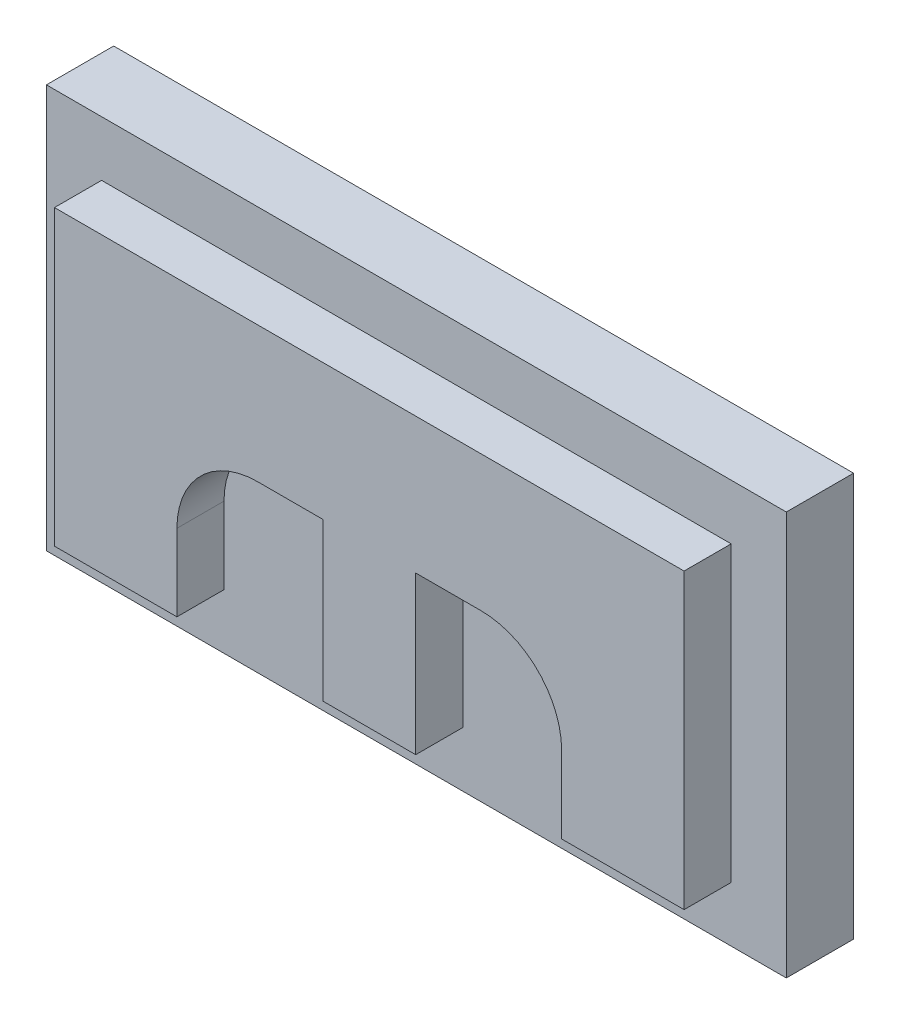
ISO-10303-21;
HEADER;
FILE_DESCRIPTION(('STEP AP214'),'2;1');
FILE_NAME('part.step','',(''),(''),'','','');
FILE_SCHEMA(('AUTOMOTIVE_DESIGN { 1 0 10303 214 1 1 1 1 }'));
ENDSEC;
DATA;
#1=APPLICATION_CONTEXT('core data for automotive mechanical design processes');
#2=APPLICATION_PROTOCOL_DEFINITION('international standard','automotive_design',2000,#1);
#3=PRODUCT_CONTEXT('',#1,'mechanical');
#4=PRODUCT('Part','Part','',(#3));
#5=PRODUCT_RELATED_PRODUCT_CATEGORY('part','',(#4));
#6=PRODUCT_DEFINITION_FORMATION('','',#4);
#7=PRODUCT_DEFINITION_CONTEXT('part definition',#1,'design');
#8=PRODUCT_DEFINITION('design','',#6,#7);
#9=PRODUCT_DEFINITION_SHAPE('','',#8);
#10=(LENGTH_UNIT() NAMED_UNIT(*) SI_UNIT(.MILLI.,.METRE.));
#11=(NAMED_UNIT(*) PLANE_ANGLE_UNIT() SI_UNIT($,.RADIAN.));
#12=(NAMED_UNIT(*) SI_UNIT($,.STERADIAN.) SOLID_ANGLE_UNIT());
#13=UNCERTAINTY_MEASURE_WITH_UNIT(LENGTH_MEASURE(1.E-05),#10,'distance_accuracy_value','');
#14=(GEOMETRIC_REPRESENTATION_CONTEXT(3) GLOBAL_UNCERTAINTY_ASSIGNED_CONTEXT((#13)) GLOBAL_UNIT_ASSIGNED_CONTEXT((#10,
#11,#12)) REPRESENTATION_CONTEXT('',''));
#15=CARTESIAN_POINT('',(0.,0.,0.));
#16=DIRECTION('',(0.,0.,1.));
#17=DIRECTION('',(1.,0.,0.));
#18=AXIS2_PLACEMENT_3D('',#15,#16,#17);
#19=CARTESIAN_POINT('',(8.2,8.2,17.));
#20=DIRECTION('',(0.,1.,0.));
#21=DIRECTION('',(0.,0.,1.));
#22=AXIS2_PLACEMENT_3D('',#19,#20,#21);
#23=PLANE('',#22);
#24=DIRECTION('',(0.,0.,1.));
#25=VECTOR('',#24,1.);
#26=CARTESIAN_POINT('',(83.6,8.2,10.));
#27=LINE('',#26,#25);
#28=CARTESIAN_POINT('',(83.6,8.2,10.));
#29=VERTEX_POINT('',#28);
#30=CARTESIAN_POINT('',(83.6,8.2,17.));
#31=VERTEX_POINT('',#30);
#32=EDGE_CURVE('E193',#29,#31,#27,.T.);
#33=ORIENTED_EDGE('',*,*,#32,.F.);
#34=DIRECTION('',(1.,0.,0.));
#35=VECTOR('',#34,1.);
#36=CARTESIAN_POINT('',(8.2,8.2,10.));
#37=LINE('',#36,#35);
#38=CARTESIAN_POINT('',(101.8,8.2,10.));
#39=VERTEX_POINT('',#38);
#40=EDGE_CURVE('E237',#29,#39,#37,.T.);
#41=ORIENTED_EDGE('',*,*,#40,.T.);
#42=DIRECTION('',(0.,0.,-1.));
#43=VECTOR('',#42,1.);
#44=CARTESIAN_POINT('',(101.8,8.2,17.));
#45=LINE('',#44,#43);
#46=CARTESIAN_POINT('',(101.8,8.2,17.));
#47=VERTEX_POINT('',#46);
#48=EDGE_CURVE('E252',#47,#39,#45,.T.);
#49=ORIENTED_EDGE('',*,*,#48,.F.);
#50=DIRECTION('',(1.,0.,0.));
#51=VECTOR('',#50,1.);
#52=CARTESIAN_POINT('',(8.2,8.2,17.));
#53=LINE('',#52,#51);
#54=EDGE_CURVE('E224',#31,#47,#53,.T.);
#55=ORIENTED_EDGE('',*,*,#54,.F.);
#56=EDGE_LOOP('',(#33,#41,#49,#55));
#57=FACE_BOUND('',#56,.T.);
#58=ADVANCED_FACE('F39',(#57),#23,.F.);
#59=DIRECTION('',(0.,0.,1.));
#60=VECTOR('',#59,1.);
#61=CARTESIAN_POINT('',(61.9,8.2,10.));
#62=LINE('',#61,#60);
#63=CARTESIAN_POINT('',(61.9,8.2,10.));
#64=VERTEX_POINT('',#63);
#65=CARTESIAN_POINT('',(61.9,8.2,17.));
#66=VERTEX_POINT('',#65);
#67=EDGE_CURVE('E167',#64,#66,#62,.T.);
#68=ORIENTED_EDGE('',*,*,#67,.T.);
#69=CARTESIAN_POINT('',(48.1,8.2,17.));
#70=VERTEX_POINT('',#69);
#71=EDGE_CURVE('E230',#70,#66,#53,.T.);
#72=ORIENTED_EDGE('',*,*,#71,.F.);
#73=DIRECTION('',(0.,0.,1.));
#74=VECTOR('',#73,1.);
#75=CARTESIAN_POINT('',(48.1,8.2,10.));
#76=LINE('',#75,#74);
#77=CARTESIAN_POINT('',(48.1,8.2,10.));
#78=VERTEX_POINT('',#77);
#79=EDGE_CURVE('E217',#78,#70,#76,.T.);
#80=ORIENTED_EDGE('',*,*,#79,.F.);
#81=EDGE_CURVE('E242',#78,#64,#37,.T.);
#82=ORIENTED_EDGE('',*,*,#81,.T.);
#83=EDGE_LOOP('',(#68,#72,#80,#82));
#84=FACE_BOUND('',#83,.T.);
#85=ADVANCED_FACE('F305',(#84),#23,.F.);
#86=CARTESIAN_POINT('',(0.,0.,17.));
#87=DIRECTION('',(0.,0.,1.));
#88=DIRECTION('',(1.,0.,0.));
#89=AXIS2_PLACEMENT_3D('',#86,#87,#88);
#90=PLANE('',#89);
#91=DIRECTION('',(1.,0.,0.));
#92=VECTOR('',#91,1.);
#93=CARTESIAN_POINT('',(83.6,31.6,17.));
#94=LINE('',#93,#92);
#95=CARTESIAN_POINT('',(61.9,31.6,17.));
#96=VERTEX_POINT('',#95);
#97=CARTESIAN_POINT('',(71.6,31.6,17.));
#98=VERTEX_POINT('',#97);
#99=EDGE_CURVE('E179',#96,#98,#94,.T.);
#100=ORIENTED_EDGE('',*,*,#99,.T.);
#101=CARTESIAN_POINT('',(71.6,19.6,17.));
#102=DIRECTION('',(0.,0.,1.));
#103=DIRECTION('',(1.,0.,0.));
#104=AXIS2_PLACEMENT_3D('',#101,#102,#103);
#105=CIRCLE('',#104,12.);
#106=CARTESIAN_POINT('',(83.6,19.6,17.));
#107=VERTEX_POINT('',#106);
#108=EDGE_CURVE('E11',#98,#107,#105,.F.);
#109=ORIENTED_EDGE('',*,*,#108,.T.);
#110=DIRECTION('',(0.,-1.,0.));
#111=VECTOR('',#110,1.);
#112=CARTESIAN_POINT('',(83.6,31.6,17.));
#113=LINE('',#112,#111);
#114=EDGE_CURVE('E189',#107,#31,#113,.T.);
#115=ORIENTED_EDGE('',*,*,#114,.T.);
#116=ORIENTED_EDGE('',*,*,#54,.T.);
#117=DIRECTION('',(0.,1.,0.));
#118=VECTOR('',#117,1.);
#119=CARTESIAN_POINT('',(101.8,51.8,17.));
#120=LINE('',#119,#118);
#121=CARTESIAN_POINT('',(101.8,51.8,17.));
#122=VERTEX_POINT('',#121);
#123=EDGE_CURVE('E229',#47,#122,#120,.T.);
#124=ORIENTED_EDGE('',*,*,#123,.T.);
#125=DIRECTION('',(-1.,0.,0.));
#126=VECTOR('',#125,1.);
#127=CARTESIAN_POINT('',(8.2,51.8,17.));
#128=LINE('',#127,#126);
#129=CARTESIAN_POINT('',(8.2,51.8,17.));
#130=VERTEX_POINT('',#129);
#131=EDGE_CURVE('E232',#122,#130,#128,.T.);
#132=ORIENTED_EDGE('',*,*,#131,.T.);
#133=DIRECTION('',(0.,-1.,0.));
#134=VECTOR('',#133,1.);
#135=CARTESIAN_POINT('',(8.2,51.8,17.));
#136=LINE('',#135,#134);
#137=CARTESIAN_POINT('',(8.2,8.2,17.));
#138=VERTEX_POINT('',#137);
#139=EDGE_CURVE('E221',#130,#138,#136,.T.);
#140=ORIENTED_EDGE('',*,*,#139,.T.);
#141=CARTESIAN_POINT('',(26.4,8.2,17.));
#142=VERTEX_POINT('',#141);
#143=EDGE_CURVE('E226',#138,#142,#53,.T.);
#144=ORIENTED_EDGE('',*,*,#143,.T.);
#145=DIRECTION('',(0.,-1.,0.));
#146=VECTOR('',#145,1.);
#147=CARTESIAN_POINT('',(26.4,31.6,17.));
#148=LINE('',#147,#146);
#149=CARTESIAN_POINT('',(26.4,19.6,17.));
#150=VERTEX_POINT('',#149);
#151=EDGE_CURVE('E196',#150,#142,#148,.T.);
#152=ORIENTED_EDGE('',*,*,#151,.F.);
#153=CARTESIAN_POINT('',(38.4,19.6,17.));
#154=DIRECTION('',(0.,0.,1.));
#155=DIRECTION('',(1.,0.,0.));
#156=AXIS2_PLACEMENT_3D('',#153,#154,#155);
#157=CIRCLE('',#156,12.);
#158=CARTESIAN_POINT('',(38.4,31.6,17.));
#159=VERTEX_POINT('',#158);
#160=EDGE_CURVE('E295',#150,#159,#157,.F.);
#161=ORIENTED_EDGE('',*,*,#160,.T.);
#162=DIRECTION('',(-1.,0.,0.));
#163=VECTOR('',#162,1.);
#164=CARTESIAN_POINT('',(26.4,31.6,17.));
#165=LINE('',#164,#163);
#166=CARTESIAN_POINT('',(48.1,31.6,17.));
#167=VERTEX_POINT('',#166);
#168=EDGE_CURVE('E201',#167,#159,#165,.T.);
#169=ORIENTED_EDGE('',*,*,#168,.F.);
#170=DIRECTION('',(0.,1.,0.));
#171=VECTOR('',#170,1.);
#172=CARTESIAN_POINT('',(48.1,31.6,17.));
#173=LINE('',#172,#171);
#174=EDGE_CURVE('E209',#70,#167,#173,.T.);
#175=ORIENTED_EDGE('',*,*,#174,.F.);
#176=ORIENTED_EDGE('',*,*,#71,.T.);
#177=DIRECTION('',(0.,1.,0.));
#178=VECTOR('',#177,1.);
#179=CARTESIAN_POINT('',(61.9,31.6,17.));
#180=LINE('',#179,#178);
#181=EDGE_CURVE('E186',#66,#96,#180,.T.);
#182=ORIENTED_EDGE('',*,*,#181,.T.);
#183=EDGE_LOOP('',(#100,#109,#115,#116,#124,#132,#140,#144,#152,#161,#169,#175,#176,#182));
#184=FACE_BOUND('',#183,.T.);
#185=ADVANCED_FACE('F300',(#184),#90,.T.);
#186=CARTESIAN_POINT('',(8.2,8.2,10.));
#187=VERTEX_POINT('',#186);
#188=CARTESIAN_POINT('',(26.4,8.2,10.));
#189=VERTEX_POINT('',#188);
#190=EDGE_CURVE('E238',#187,#189,#37,.T.);
#191=ORIENTED_EDGE('',*,*,#190,.T.);
#192=DIRECTION('',(0.,0.,1.));
#193=VECTOR('',#192,1.);
#194=CARTESIAN_POINT('',(26.4,8.2,10.));
#195=LINE('',#194,#193);
#196=EDGE_CURVE('E207',#189,#142,#195,.T.);
#197=ORIENTED_EDGE('',*,*,#196,.T.);
#198=ORIENTED_EDGE('',*,*,#143,.F.);
#199=DIRECTION('',(0.,0.,-1.));
#200=VECTOR('',#199,1.);
#201=CARTESIAN_POINT('',(8.2,8.2,17.));
#202=LINE('',#201,#200);
#203=EDGE_CURVE('E255',#138,#187,#202,.T.);
#204=ORIENTED_EDGE('',*,*,#203,.T.);
#205=EDGE_LOOP('',(#191,#197,#198,#204));
#206=FACE_BOUND('',#205,.T.);
#207=ADVANCED_FACE('F327',(#206),#23,.F.);
#208=CARTESIAN_POINT('',(0.,0.,10.));
#209=DIRECTION('',(0.,0.,-1.));
#210=DIRECTION('',(-1.,0.,0.));
#211=AXIS2_PLACEMENT_3D('',#208,#209,#210);
#212=PLANE('',#211);
#213=DIRECTION('',(0.,-1.,0.));
#214=VECTOR('',#213,1.);
#215=CARTESIAN_POINT('',(0.,0.,10.));
#216=LINE('',#215,#214);
#217=CARTESIAN_POINT('',(0.,60.,10.));
#218=VERTEX_POINT('',#217);
#219=CARTESIAN_POINT('',(0.,0.,10.));
#220=VERTEX_POINT('',#219);
#221=EDGE_CURVE('E259',#218,#220,#216,.T.);
#222=ORIENTED_EDGE('',*,*,#221,.T.);
#223=DIRECTION('',(1.,0.,0.));
#224=VECTOR('',#223,1.);
#225=CARTESIAN_POINT('',(0.,0.,10.));
#226=LINE('',#225,#224);
#227=CARTESIAN_POINT('',(110.,0.,10.));
#228=VERTEX_POINT('',#227);
#229=EDGE_CURVE('E262',#220,#228,#226,.T.);
#230=ORIENTED_EDGE('',*,*,#229,.T.);
#231=DIRECTION('',(0.,1.,0.));
#232=VECTOR('',#231,1.);
#233=CARTESIAN_POINT('',(110.,0.,10.));
#234=LINE('',#233,#232);
#235=CARTESIAN_POINT('',(110.,60.,10.));
#236=VERTEX_POINT('',#235);
#237=EDGE_CURVE('E265',#228,#236,#234,.T.);
#238=ORIENTED_EDGE('',*,*,#237,.T.);
#239=DIRECTION('',(-1.,0.,0.));
#240=VECTOR('',#239,1.);
#241=CARTESIAN_POINT('',(0.,60.,10.));
#242=LINE('',#241,#240);
#243=EDGE_CURVE('E267',#236,#218,#242,.T.);
#244=ORIENTED_EDGE('',*,*,#243,.T.);
#245=EDGE_LOOP('',(#222,#230,#238,#244));
#246=FACE_BOUND('',#245,.T.);
#247=DIRECTION('',(0.,-1.,0.));
#248=VECTOR('',#247,1.);
#249=CARTESIAN_POINT('',(83.6,31.6,10.));
#250=LINE('',#249,#248);
#251=CARTESIAN_POINT('',(83.6,19.6,10.));
#252=VERTEX_POINT('',#251);
#253=EDGE_CURVE('E184',#252,#29,#250,.T.);
#254=ORIENTED_EDGE('',*,*,#253,.F.);
#255=CARTESIAN_POINT('',(71.6,19.6,10.));
#256=DIRECTION('',(0.,0.,-1.));
#257=DIRECTION('',(-1.,0.,0.));
#258=AXIS2_PLACEMENT_3D('',#255,#256,#257);
#259=CIRCLE('',#258,12.);
#260=CARTESIAN_POINT('',(71.6,31.6,10.));
#261=VERTEX_POINT('',#260);
#262=EDGE_CURVE('E47',#252,#261,#259,.F.);
#263=ORIENTED_EDGE('',*,*,#262,.T.);
#264=DIRECTION('',(1.,0.,0.));
#265=VECTOR('',#264,1.);
#266=CARTESIAN_POINT('',(83.6,31.6,10.));
#267=LINE('',#266,#265);
#268=CARTESIAN_POINT('',(61.9,31.6,10.));
#269=VERTEX_POINT('',#268);
#270=EDGE_CURVE('E172',#269,#261,#267,.T.);
#271=ORIENTED_EDGE('',*,*,#270,.F.);
#272=DIRECTION('',(0.,1.,0.));
#273=VECTOR('',#272,1.);
#274=CARTESIAN_POINT('',(61.9,31.6,10.));
#275=LINE('',#274,#273);
#276=EDGE_CURVE('E161',#64,#269,#275,.T.);
#277=ORIENTED_EDGE('',*,*,#276,.F.);
#278=ORIENTED_EDGE('',*,*,#81,.F.);
#279=DIRECTION('',(0.,1.,0.));
#280=VECTOR('',#279,1.);
#281=CARTESIAN_POINT('',(48.1,31.6,10.));
#282=LINE('',#281,#280);
#283=CARTESIAN_POINT('',(48.1,31.6,10.));
#284=VERTEX_POINT('',#283);
#285=EDGE_CURVE('E200',#78,#284,#282,.T.);
#286=ORIENTED_EDGE('',*,*,#285,.T.);
#287=DIRECTION('',(-1.,0.,0.));
#288=VECTOR('',#287,1.);
#289=CARTESIAN_POINT('',(26.4,31.6,10.));
#290=LINE('',#289,#288);
#291=CARTESIAN_POINT('',(38.4,31.6,10.));
#292=VERTEX_POINT('',#291);
#293=EDGE_CURVE('E204',#284,#292,#290,.T.);
#294=ORIENTED_EDGE('',*,*,#293,.T.);
#295=CARTESIAN_POINT('',(38.4,19.6,10.));
#296=DIRECTION('',(0.,0.,-1.));
#297=DIRECTION('',(-1.,0.,0.));
#298=AXIS2_PLACEMENT_3D('',#295,#296,#297);
#299=CIRCLE('',#298,12.);
#300=CARTESIAN_POINT('',(26.4,19.6,10.));
#301=VERTEX_POINT('',#300);
#302=EDGE_CURVE('E293',#292,#301,#299,.F.);
#303=ORIENTED_EDGE('',*,*,#302,.T.);
#304=DIRECTION('',(0.,-1.,0.));
#305=VECTOR('',#304,1.);
#306=CARTESIAN_POINT('',(26.4,31.6,10.));
#307=LINE('',#306,#305);
#308=EDGE_CURVE('E198',#301,#189,#307,.T.);
#309=ORIENTED_EDGE('',*,*,#308,.T.);
#310=ORIENTED_EDGE('',*,*,#190,.F.);
#311=DIRECTION('',(0.,-1.,0.));
#312=VECTOR('',#311,1.);
#313=CARTESIAN_POINT('',(8.2,51.8,10.));
#314=LINE('',#313,#312);
#315=CARTESIAN_POINT('',(8.2,51.8,10.));
#316=VERTEX_POINT('',#315);
#317=EDGE_CURVE('E216',#316,#187,#314,.T.);
#318=ORIENTED_EDGE('',*,*,#317,.F.);
#319=DIRECTION('',(-1.,0.,0.));
#320=VECTOR('',#319,1.);
#321=CARTESIAN_POINT('',(8.2,51.8,10.));
#322=LINE('',#321,#320);
#323=CARTESIAN_POINT('',(101.8,51.8,10.));
#324=VERTEX_POINT('',#323);
#325=EDGE_CURVE('E225',#324,#316,#322,.T.);
#326=ORIENTED_EDGE('',*,*,#325,.F.);
#327=DIRECTION('',(0.,1.,0.));
#328=VECTOR('',#327,1.);
#329=CARTESIAN_POINT('',(101.8,51.8,10.));
#330=LINE('',#329,#328);
#331=EDGE_CURVE('E241',#39,#324,#330,.T.);
#332=ORIENTED_EDGE('',*,*,#331,.F.);
#333=ORIENTED_EDGE('',*,*,#40,.F.);
#334=EDGE_LOOP('',(#254,#263,#271,#277,#278,#286,#294,#303,#309,#310,#318,#326,#332,#333));
#335=FACE_BOUND('',#334,.T.);
#336=ADVANCED_FACE('F182',(#246,#335),#212,.F.);
#337=CARTESIAN_POINT('',(0.,0.,10.));
#338=DIRECTION('',(1.,0.,0.));
#339=DIRECTION('',(0.,0.,-1.));
#340=AXIS2_PLACEMENT_3D('',#337,#338,#339);
#341=PLANE('',#340);
#342=DIRECTION('',(0.,-1.,0.));
#343=VECTOR('',#342,1.);
#344=CARTESIAN_POINT('',(0.,0.,0.));
#345=LINE('',#344,#343);
#346=CARTESIAN_POINT('',(0.,60.,0.));
#347=VERTEX_POINT('',#346);
#348=CARTESIAN_POINT('',(0.,0.,0.));
#349=VERTEX_POINT('',#348);
#350=EDGE_CURVE('E258',#347,#349,#345,.T.);
#351=ORIENTED_EDGE('',*,*,#350,.T.);
#352=DIRECTION('',(0.,0.,-1.));
#353=VECTOR('',#352,1.);
#354=CARTESIAN_POINT('',(0.,0.,10.));
#355=LINE('',#354,#353);
#356=EDGE_CURVE('E285',#220,#349,#355,.T.);
#357=ORIENTED_EDGE('',*,*,#356,.F.);
#358=ORIENTED_EDGE('',*,*,#221,.F.);
#359=DIRECTION('',(0.,0.,-1.));
#360=VECTOR('',#359,1.);
#361=CARTESIAN_POINT('',(0.,60.,10.));
#362=LINE('',#361,#360);
#363=EDGE_CURVE('E269',#218,#347,#362,.T.);
#364=ORIENTED_EDGE('',*,*,#363,.T.);
#365=EDGE_LOOP('',(#351,#357,#358,#364));
#366=FACE_BOUND('',#365,.T.);
#367=ADVANCED_FACE('F341',(#366),#341,.F.);
#368=CARTESIAN_POINT('',(0.,0.,10.));
#369=DIRECTION('',(0.,1.,0.));
#370=DIRECTION('',(0.,0.,1.));
#371=AXIS2_PLACEMENT_3D('',#368,#369,#370);
#372=PLANE('',#371);
#373=DIRECTION('',(1.,0.,0.));
#374=VECTOR('',#373,1.);
#375=CARTESIAN_POINT('',(0.,0.,0.));
#376=LINE('',#375,#374);
#377=CARTESIAN_POINT('',(110.,0.,0.));
#378=VERTEX_POINT('',#377);
#379=EDGE_CURVE('E272',#349,#378,#376,.T.);
#380=ORIENTED_EDGE('',*,*,#379,.T.);
#381=DIRECTION('',(0.,0.,-1.));
#382=VECTOR('',#381,1.);
#383=CARTESIAN_POINT('',(110.,0.,10.));
#384=LINE('',#383,#382);
#385=EDGE_CURVE('E282',#228,#378,#384,.T.);
#386=ORIENTED_EDGE('',*,*,#385,.F.);
#387=ORIENTED_EDGE('',*,*,#229,.F.);
#388=ORIENTED_EDGE('',*,*,#356,.T.);
#389=EDGE_LOOP('',(#380,#386,#387,#388));
#390=FACE_BOUND('',#389,.T.);
#391=ADVANCED_FACE('F489',(#390),#372,.F.);
#392=CARTESIAN_POINT('',(110.,0.,10.));
#393=DIRECTION('',(-1.,0.,0.));
#394=DIRECTION('',(0.,0.,1.));
#395=AXIS2_PLACEMENT_3D('',#392,#393,#394);
#396=PLANE('',#395);
#397=DIRECTION('',(0.,1.,0.));
#398=VECTOR('',#397,1.);
#399=CARTESIAN_POINT('',(110.,0.,0.));
#400=LINE('',#399,#398);
#401=CARTESIAN_POINT('',(110.,60.,0.));
#402=VERTEX_POINT('',#401);
#403=EDGE_CURVE('E274',#378,#402,#400,.T.);
#404=ORIENTED_EDGE('',*,*,#403,.T.);
#405=DIRECTION('',(0.,0.,-1.));
#406=VECTOR('',#405,1.);
#407=CARTESIAN_POINT('',(110.,60.,10.));
#408=LINE('',#407,#406);
#409=EDGE_CURVE('E279',#236,#402,#408,.T.);
#410=ORIENTED_EDGE('',*,*,#409,.F.);
#411=ORIENTED_EDGE('',*,*,#237,.F.);
#412=ORIENTED_EDGE('',*,*,#385,.T.);
#413=EDGE_LOOP('',(#404,#410,#411,#412));
#414=FACE_BOUND('',#413,.T.);
#415=ADVANCED_FACE('F480',(#414),#396,.F.);
#416=CARTESIAN_POINT('',(0.,60.,10.));
#417=DIRECTION('',(0.,-1.,0.));
#418=DIRECTION('',(0.,0.,-1.));
#419=AXIS2_PLACEMENT_3D('',#416,#417,#418);
#420=PLANE('',#419);
#421=DIRECTION('',(-1.,0.,0.));
#422=VECTOR('',#421,1.);
#423=CARTESIAN_POINT('',(0.,60.,0.));
#424=LINE('',#423,#422);
#425=EDGE_CURVE('E263',#402,#347,#424,.T.);
#426=ORIENTED_EDGE('',*,*,#425,.T.);
#427=ORIENTED_EDGE('',*,*,#363,.F.);
#428=ORIENTED_EDGE('',*,*,#243,.F.);
#429=ORIENTED_EDGE('',*,*,#409,.T.);
#430=EDGE_LOOP('',(#426,#427,#428,#429));
#431=FACE_BOUND('',#430,.T.);
#432=ADVANCED_FACE('F471',(#431),#420,.F.);
#433=CARTESIAN_POINT('',(0.,0.,0.));
#434=DIRECTION('',(0.,0.,-1.));
#435=DIRECTION('',(-1.,0.,0.));
#436=AXIS2_PLACEMENT_3D('',#433,#434,#435);
#437=PLANE('',#436);
#438=ORIENTED_EDGE('',*,*,#350,.F.);
#439=ORIENTED_EDGE('',*,*,#425,.F.);
#440=ORIENTED_EDGE('',*,*,#403,.F.);
#441=ORIENTED_EDGE('',*,*,#379,.F.);
#442=EDGE_LOOP('',(#438,#439,#440,#441));
#443=FACE_BOUND('',#442,.T.);
#444=ADVANCED_FACE('F457',(#443),#437,.T.);
#445=CARTESIAN_POINT('',(8.2,51.8,17.));
#446=DIRECTION('',(1.,0.,0.));
#447=DIRECTION('',(0.,1.,0.));
#448=AXIS2_PLACEMENT_3D('',#445,#446,#447);
#449=PLANE('',#448);
#450=ORIENTED_EDGE('',*,*,#317,.T.);
#451=ORIENTED_EDGE('',*,*,#203,.F.);
#452=ORIENTED_EDGE('',*,*,#139,.F.);
#453=DIRECTION('',(0.,0.,-1.));
#454=VECTOR('',#453,1.);
#455=CARTESIAN_POINT('',(8.2,51.8,17.));
#456=LINE('',#455,#454);
#457=EDGE_CURVE('E234',#130,#316,#456,.T.);
#458=ORIENTED_EDGE('',*,*,#457,.T.);
#459=EDGE_LOOP('',(#450,#451,#452,#458));
#460=FACE_BOUND('',#459,.T.);
#461=ADVANCED_FACE('F357',(#460),#449,.F.);
#462=CARTESIAN_POINT('',(101.8,51.8,17.));
#463=DIRECTION('',(-1.,0.,0.));
#464=DIRECTION('',(0.,0.,1.));
#465=AXIS2_PLACEMENT_3D('',#462,#463,#464);
#466=PLANE('',#465);
#467=ORIENTED_EDGE('',*,*,#331,.T.);
#468=DIRECTION('',(0.,0.,-1.));
#469=VECTOR('',#468,1.);
#470=CARTESIAN_POINT('',(101.8,51.8,17.));
#471=LINE('',#470,#469);
#472=EDGE_CURVE('E249',#122,#324,#471,.T.);
#473=ORIENTED_EDGE('',*,*,#472,.F.);
#474=ORIENTED_EDGE('',*,*,#123,.F.);
#475=ORIENTED_EDGE('',*,*,#48,.T.);
#476=EDGE_LOOP('',(#467,#473,#474,#475));
#477=FACE_BOUND('',#476,.T.);
#478=ADVANCED_FACE('F316',(#477),#466,.F.);
#479=CARTESIAN_POINT('',(8.2,51.8,17.));
#480=DIRECTION('',(0.,-1.,0.));
#481=DIRECTION('',(0.,0.,-1.));
#482=AXIS2_PLACEMENT_3D('',#479,#480,#481);
#483=PLANE('',#482);
#484=ORIENTED_EDGE('',*,*,#325,.T.);
#485=ORIENTED_EDGE('',*,*,#457,.F.);
#486=ORIENTED_EDGE('',*,*,#131,.F.);
#487=ORIENTED_EDGE('',*,*,#472,.T.);
#488=EDGE_LOOP('',(#484,#485,#486,#487));
#489=FACE_BOUND('',#488,.T.);
#490=ADVANCED_FACE('F359',(#489),#483,.F.);
#491=CARTESIAN_POINT('',(26.4,31.6,10.));
#492=DIRECTION('',(-1.,0.,0.));
#493=DIRECTION('',(0.,0.,1.));
#494=AXIS2_PLACEMENT_3D('',#491,#492,#493);
#495=PLANE('',#494);
#496=ORIENTED_EDGE('',*,*,#308,.F.);
#497=DIRECTION('',(0.,0.,1.));
#498=VECTOR('',#497,1.);
#499=CARTESIAN_POINT('',(26.4,19.6,17.));
#500=LINE('',#499,#498);
#501=EDGE_CURVE('E288',#301,#150,#500,.T.);
#502=ORIENTED_EDGE('',*,*,#501,.T.);
#503=ORIENTED_EDGE('',*,*,#151,.T.);
#504=ORIENTED_EDGE('',*,*,#196,.F.);
#505=EDGE_LOOP('',(#496,#502,#503,#504));
#506=FACE_BOUND('',#505,.T.);
#507=ADVANCED_FACE('F352',(#506),#495,.F.);
#508=CARTESIAN_POINT('',(26.4,31.6,10.));
#509=DIRECTION('',(0.,1.,0.));
#510=DIRECTION('',(0.,0.,1.));
#511=AXIS2_PLACEMENT_3D('',#508,#509,#510);
#512=PLANE('',#511);
#513=ORIENTED_EDGE('',*,*,#168,.T.);
#514=DIRECTION('',(0.,0.,1.));
#515=VECTOR('',#514,1.);
#516=CARTESIAN_POINT('',(38.4,31.6,10.));
#517=LINE('',#516,#515);
#518=EDGE_CURVE('E291',#159,#292,#517,.F.);
#519=ORIENTED_EDGE('',*,*,#518,.T.);
#520=ORIENTED_EDGE('',*,*,#293,.F.);
#521=DIRECTION('',(0.,0.,1.));
#522=VECTOR('',#521,1.);
#523=CARTESIAN_POINT('',(48.1,31.6,10.));
#524=LINE('',#523,#522);
#525=EDGE_CURVE('E214',#284,#167,#524,.T.);
#526=ORIENTED_EDGE('',*,*,#525,.T.);
#527=EDGE_LOOP('',(#513,#519,#520,#526));
#528=FACE_BOUND('',#527,.T.);
#529=ADVANCED_FACE('F365',(#528),#512,.F.);
#530=CARTESIAN_POINT('',(48.1,31.6,10.));
#531=DIRECTION('',(1.,0.,0.));
#532=DIRECTION('',(0.,0.,-1.));
#533=AXIS2_PLACEMENT_3D('',#530,#531,#532);
#534=PLANE('',#533);
#535=ORIENTED_EDGE('',*,*,#174,.T.);
#536=ORIENTED_EDGE('',*,*,#525,.F.);
#537=ORIENTED_EDGE('',*,*,#285,.F.);
#538=ORIENTED_EDGE('',*,*,#79,.T.);
#539=EDGE_LOOP('',(#535,#536,#537,#538));
#540=FACE_BOUND('',#539,.T.);
#541=ADVANCED_FACE('F368',(#540),#534,.F.);
#542=CARTESIAN_POINT('',(38.4,19.6,10.));
#543=DIRECTION('',(0.,0.,-1.));
#544=DIRECTION('',(-1.,0.,0.));
#545=AXIS2_PLACEMENT_3D('',#542,#543,#544);
#546=CYLINDRICAL_SURFACE('',#545,12.);
#547=ORIENTED_EDGE('',*,*,#302,.F.);
#548=ORIENTED_EDGE('',*,*,#518,.F.);
#549=ORIENTED_EDGE('',*,*,#160,.F.);
#550=ORIENTED_EDGE('',*,*,#501,.F.);
#551=EDGE_LOOP('',(#547,#548,#549,#550));
#552=FACE_BOUND('',#551,.T.);
#553=ADVANCED_FACE('F370',(#552),#546,.F.);
#554=CARTESIAN_POINT('',(83.6,31.6,10.));
#555=DIRECTION('',(-1.,0.,0.));
#556=DIRECTION('',(0.,0.,1.));
#557=AXIS2_PLACEMENT_3D('',#554,#555,#556);
#558=PLANE('',#557);
#559=ORIENTED_EDGE('',*,*,#114,.F.);
#560=DIRECTION('',(0.,0.,1.));
#561=VECTOR('',#560,1.);
#562=CARTESIAN_POINT('',(83.6,19.6,10.));
#563=LINE('',#562,#561);
#564=EDGE_CURVE('E54',#107,#252,#563,.F.);
#565=ORIENTED_EDGE('',*,*,#564,.T.);
#566=ORIENTED_EDGE('',*,*,#253,.T.);
#567=ORIENTED_EDGE('',*,*,#32,.T.);
#568=EDGE_LOOP('',(#559,#565,#566,#567));
#569=FACE_BOUND('',#568,.T.);
#570=ADVANCED_FACE('F319',(#569),#558,.T.);
#571=CARTESIAN_POINT('',(61.9,31.6,10.));
#572=DIRECTION('',(1.,0.,0.));
#573=DIRECTION('',(0.,0.,-1.));
#574=AXIS2_PLACEMENT_3D('',#571,#572,#573);
#575=PLANE('',#574);
#576=ORIENTED_EDGE('',*,*,#181,.F.);
#577=ORIENTED_EDGE('',*,*,#67,.F.);
#578=ORIENTED_EDGE('',*,*,#276,.T.);
#579=DIRECTION('',(0.,0.,1.));
#580=VECTOR('',#579,1.);
#581=CARTESIAN_POINT('',(61.9,31.6,10.));
#582=LINE('',#581,#580);
#583=EDGE_CURVE('E164',#269,#96,#582,.T.);
#584=ORIENTED_EDGE('',*,*,#583,.T.);
#585=EDGE_LOOP('',(#576,#577,#578,#584));
#586=FACE_BOUND('',#585,.T.);
#587=ADVANCED_FACE('F163',(#586),#575,.T.);
#588=CARTESIAN_POINT('',(83.6,31.6,10.));
#589=DIRECTION('',(0.,-1.,0.));
#590=DIRECTION('',(0.,0.,-1.));
#591=AXIS2_PLACEMENT_3D('',#588,#589,#590);
#592=PLANE('',#591);
#593=ORIENTED_EDGE('',*,*,#270,.T.);
#594=DIRECTION('',(0.,0.,1.));
#595=VECTOR('',#594,1.);
#596=CARTESIAN_POINT('',(71.6,31.6,17.));
#597=LINE('',#596,#595);
#598=EDGE_CURVE('E297',#261,#98,#597,.T.);
#599=ORIENTED_EDGE('',*,*,#598,.T.);
#600=ORIENTED_EDGE('',*,*,#99,.F.);
#601=ORIENTED_EDGE('',*,*,#583,.F.);
#602=EDGE_LOOP('',(#593,#599,#600,#601));
#603=FACE_BOUND('',#602,.T.);
#604=ADVANCED_FACE('F176',(#603),#592,.T.);
#605=CARTESIAN_POINT('',(71.6,19.6,10.));
#606=DIRECTION('',(0.,0.,-1.));
#607=DIRECTION('',(-1.,0.,0.));
#608=AXIS2_PLACEMENT_3D('',#605,#606,#607);
#609=CYLINDRICAL_SURFACE('',#608,12.);
#610=ORIENTED_EDGE('',*,*,#262,.F.);
#611=ORIENTED_EDGE('',*,*,#564,.F.);
#612=ORIENTED_EDGE('',*,*,#108,.F.);
#613=ORIENTED_EDGE('',*,*,#598,.F.);
#614=EDGE_LOOP('',(#610,#611,#612,#613));
#615=FACE_BOUND('',#614,.T.);
#616=ADVANCED_FACE('F41',(#615),#609,.F.);
#617=CLOSED_SHELL('',(#58,#85,#185,#207,#336,#367,#391,#415,#432,#444,#461,#478,#490,#507,#529,
#541,#553,#570,#587,#604,#616));
#618=MANIFOLD_SOLID_BREP('B2',#617);
#619=ADVANCED_BREP_SHAPE_REPRESENTATION('',(#18,#618),#14);
#620=SHAPE_DEFINITION_REPRESENTATION(#9,#619);
ENDSEC;
END-ISO-10303-21;
